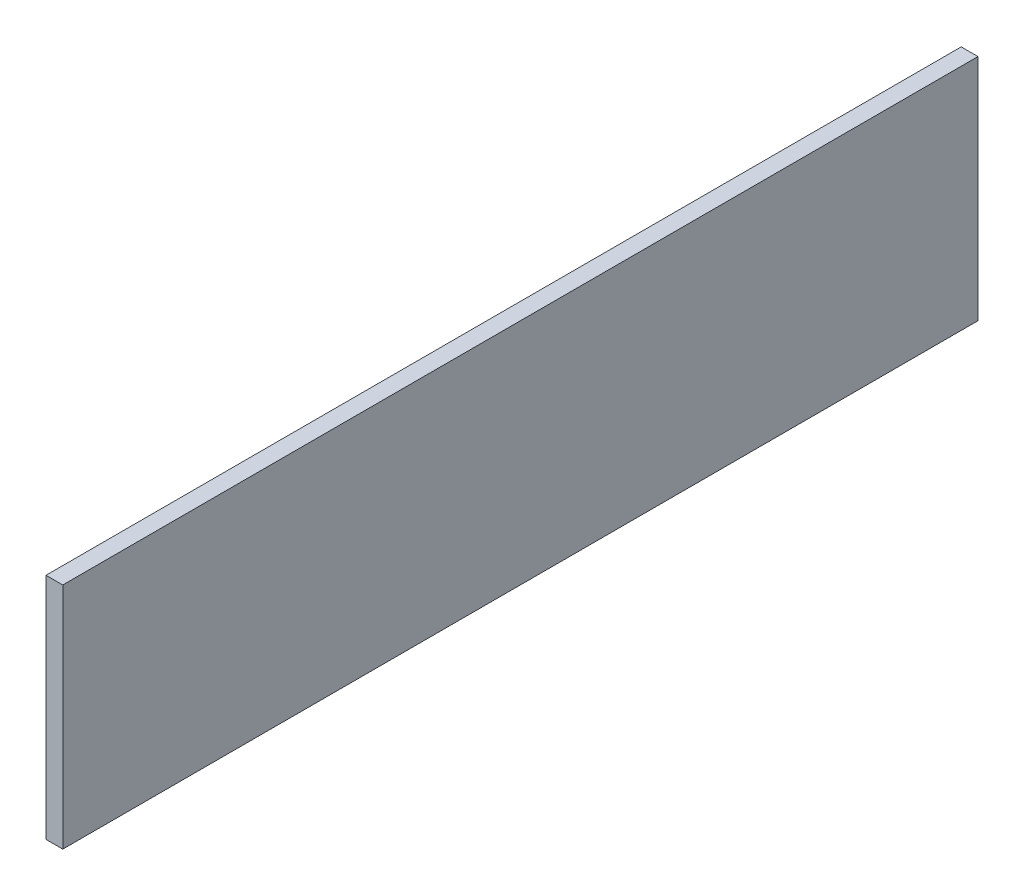
ISO-10303-21;
HEADER;
FILE_DESCRIPTION(('STEP AP214'),'2;1');
FILE_NAME('part.step','',(''),(''),'','','');
FILE_SCHEMA(('AUTOMOTIVE_DESIGN { 1 0 10303 214 1 1 1 1 }'));
ENDSEC;
DATA;
#1=APPLICATION_CONTEXT('core data for automotive mechanical design processes');
#2=APPLICATION_PROTOCOL_DEFINITION('international standard','automotive_design',2000,#1);
#3=PRODUCT_CONTEXT('',#1,'mechanical');
#4=PRODUCT('Part','Part','',(#3));
#5=PRODUCT_RELATED_PRODUCT_CATEGORY('part','',(#4));
#6=PRODUCT_DEFINITION_FORMATION('','',#4);
#7=PRODUCT_DEFINITION_CONTEXT('part definition',#1,'design');
#8=PRODUCT_DEFINITION('design','',#6,#7);
#9=PRODUCT_DEFINITION_SHAPE('','',#8);
#10=(LENGTH_UNIT() NAMED_UNIT(*) SI_UNIT(.MILLI.,.METRE.));
#11=(NAMED_UNIT(*) PLANE_ANGLE_UNIT() SI_UNIT($,.RADIAN.));
#12=(NAMED_UNIT(*) SI_UNIT($,.STERADIAN.) SOLID_ANGLE_UNIT());
#13=UNCERTAINTY_MEASURE_WITH_UNIT(LENGTH_MEASURE(1.E-05),#10,'distance_accuracy_value','');
#14=(GEOMETRIC_REPRESENTATION_CONTEXT(3) GLOBAL_UNCERTAINTY_ASSIGNED_CONTEXT((#13)) GLOBAL_UNIT_ASSIGNED_CONTEXT((#10,
#11,#12)) REPRESENTATION_CONTEXT('',''));
#15=CARTESIAN_POINT('',(0.,0.,0.));
#16=DIRECTION('',(0.,0.,1.));
#17=DIRECTION('',(1.,0.,0.));
#18=AXIS2_PLACEMENT_3D('',#15,#16,#17);
#19=CARTESIAN_POINT('',(5.588,-38.1,-152.4));
#20=DIRECTION('',(0.,0.,1.));
#21=DIRECTION('',(1.,0.,0.));
#22=AXIS2_PLACEMENT_3D('',#19,#20,#21);
#23=PLANE('',#22);
#24=DIRECTION('',(0.,1.,0.));
#25=VECTOR('',#24,1.);
#26=CARTESIAN_POINT('',(0.,-38.1,-152.4));
#27=LINE('',#26,#25);
#28=CARTESIAN_POINT('',(0.,-38.1,-152.4));
#29=VERTEX_POINT('',#28);
#30=CARTESIAN_POINT('',(0.,38.1,-152.4));
#31=VERTEX_POINT('',#30);
#32=EDGE_CURVE('E96',#29,#31,#27,.T.);
#33=ORIENTED_EDGE('',*,*,#32,.T.);
#34=DIRECTION('',(-1.,0.,0.));
#35=VECTOR('',#34,1.);
#36=CARTESIAN_POINT('',(5.588,38.1,-152.4));
#37=LINE('',#36,#35);
#38=CARTESIAN_POINT('',(5.588,38.1,-152.4));
#39=VERTEX_POINT('',#38);
#40=EDGE_CURVE('E11',#39,#31,#37,.T.);
#41=ORIENTED_EDGE('',*,*,#40,.F.);
#42=DIRECTION('',(0.,1.,0.));
#43=VECTOR('',#42,1.);
#44=CARTESIAN_POINT('',(5.588,-38.1,-152.4));
#45=LINE('',#44,#43);
#46=CARTESIAN_POINT('',(5.588,-38.1,-152.4));
#47=VERTEX_POINT('',#46);
#48=EDGE_CURVE('E84',#47,#39,#45,.T.);
#49=ORIENTED_EDGE('',*,*,#48,.F.);
#50=DIRECTION('',(-1.,0.,0.));
#51=VECTOR('',#50,1.);
#52=CARTESIAN_POINT('',(5.588,-38.1,-152.4));
#53=LINE('',#52,#51);
#54=EDGE_CURVE('E92',#47,#29,#53,.T.);
#55=ORIENTED_EDGE('',*,*,#54,.T.);
#56=EDGE_LOOP('',(#33,#41,#49,#55));
#57=FACE_BOUND('',#56,.T.);
#58=ADVANCED_FACE('F33',(#57),#23,.F.);
#59=CARTESIAN_POINT('',(5.588,38.1,152.4));
#60=DIRECTION('',(0.,-1.,0.));
#61=DIRECTION('',(0.,0.,-1.));
#62=AXIS2_PLACEMENT_3D('',#59,#60,#61);
#63=PLANE('',#62);
#64=DIRECTION('',(0.,0.,1.));
#65=VECTOR('',#64,1.);
#66=CARTESIAN_POINT('',(0.,38.1,152.4));
#67=LINE('',#66,#65);
#68=CARTESIAN_POINT('',(0.,38.1,152.4));
#69=VERTEX_POINT('',#68);
#70=EDGE_CURVE('E88',#31,#69,#67,.T.);
#71=ORIENTED_EDGE('',*,*,#70,.T.);
#72=DIRECTION('',(-1.,0.,0.));
#73=VECTOR('',#72,1.);
#74=CARTESIAN_POINT('',(5.588,38.1,152.4));
#75=LINE('',#74,#73);
#76=CARTESIAN_POINT('',(5.588,38.1,152.4));
#77=VERTEX_POINT('',#76);
#78=EDGE_CURVE('E41',#77,#69,#75,.T.);
#79=ORIENTED_EDGE('',*,*,#78,.F.);
#80=DIRECTION('',(0.,0.,1.));
#81=VECTOR('',#80,1.);
#82=CARTESIAN_POINT('',(5.588,38.1,152.4));
#83=LINE('',#82,#81);
#84=EDGE_CURVE('E79',#39,#77,#83,.T.);
#85=ORIENTED_EDGE('',*,*,#84,.F.);
#86=ORIENTED_EDGE('',*,*,#40,.T.);
#87=EDGE_LOOP('',(#71,#79,#85,#86));
#88=FACE_BOUND('',#87,.T.);
#89=ADVANCED_FACE('F87',(#88),#63,.F.);
#90=CARTESIAN_POINT('',(5.588,-38.1,152.4));
#91=DIRECTION('',(0.,0.,-1.));
#92=DIRECTION('',(-1.,0.,0.));
#93=AXIS2_PLACEMENT_3D('',#90,#91,#92);
#94=PLANE('',#93);
#95=DIRECTION('',(0.,-1.,0.));
#96=VECTOR('',#95,1.);
#97=CARTESIAN_POINT('',(0.,-38.1,152.4));
#98=LINE('',#97,#96);
#99=CARTESIAN_POINT('',(0.,-38.1,152.4));
#100=VERTEX_POINT('',#99);
#101=EDGE_CURVE('E66',#69,#100,#98,.T.);
#102=ORIENTED_EDGE('',*,*,#101,.T.);
#103=DIRECTION('',(-1.,0.,0.));
#104=VECTOR('',#103,1.);
#105=CARTESIAN_POINT('',(5.588,-38.1,152.4));
#106=LINE('',#105,#104);
#107=CARTESIAN_POINT('',(5.588,-38.1,152.4));
#108=VERTEX_POINT('',#107);
#109=EDGE_CURVE('E89',#108,#100,#106,.T.);
#110=ORIENTED_EDGE('',*,*,#109,.F.);
#111=DIRECTION('',(0.,-1.,0.));
#112=VECTOR('',#111,1.);
#113=CARTESIAN_POINT('',(5.588,-38.1,152.4));
#114=LINE('',#113,#112);
#115=EDGE_CURVE('E82',#77,#108,#114,.T.);
#116=ORIENTED_EDGE('',*,*,#115,.F.);
#117=ORIENTED_EDGE('',*,*,#78,.T.);
#118=EDGE_LOOP('',(#102,#110,#116,#117));
#119=FACE_BOUND('',#118,.T.);
#120=ADVANCED_FACE('F90',(#119),#94,.F.);
#121=CARTESIAN_POINT('',(5.588,-38.1,152.4));
#122=DIRECTION('',(0.,1.,0.));
#123=DIRECTION('',(0.,0.,1.));
#124=AXIS2_PLACEMENT_3D('',#121,#122,#123);
#125=PLANE('',#124);
#126=DIRECTION('',(0.,0.,-1.));
#127=VECTOR('',#126,1.);
#128=CARTESIAN_POINT('',(0.,-38.1,152.4));
#129=LINE('',#128,#127);
#130=EDGE_CURVE('E72',#100,#29,#129,.T.);
#131=ORIENTED_EDGE('',*,*,#130,.T.);
#132=ORIENTED_EDGE('',*,*,#54,.F.);
#133=DIRECTION('',(0.,0.,-1.));
#134=VECTOR('',#133,1.);
#135=CARTESIAN_POINT('',(5.588,-38.1,152.4));
#136=LINE('',#135,#134);
#137=EDGE_CURVE('E49',#108,#47,#136,.T.);
#138=ORIENTED_EDGE('',*,*,#137,.F.);
#139=ORIENTED_EDGE('',*,*,#109,.T.);
#140=EDGE_LOOP('',(#131,#132,#138,#139));
#141=FACE_BOUND('',#140,.T.);
#142=ADVANCED_FACE('F103',(#141),#125,.F.);
#143=CARTESIAN_POINT('',(5.588,0.,0.));
#144=DIRECTION('',(-1.,0.,0.));
#145=DIRECTION('',(0.,0.,1.));
#146=AXIS2_PLACEMENT_3D('',#143,#144,#145);
#147=PLANE('',#146);
#148=ORIENTED_EDGE('',*,*,#48,.T.);
#149=ORIENTED_EDGE('',*,*,#84,.T.);
#150=ORIENTED_EDGE('',*,*,#115,.T.);
#151=ORIENTED_EDGE('',*,*,#137,.T.);
#152=EDGE_LOOP('',(#148,#149,#150,#151));
#153=FACE_BOUND('',#152,.T.);
#154=ADVANCED_FACE('F80',(#153),#147,.F.);
#155=CARTESIAN_POINT('',(0.,0.,0.));
#156=DIRECTION('',(-1.,0.,0.));
#157=DIRECTION('',(0.,0.,1.));
#158=AXIS2_PLACEMENT_3D('',#155,#156,#157);
#159=PLANE('',#158);
#160=ORIENTED_EDGE('',*,*,#32,.F.);
#161=ORIENTED_EDGE('',*,*,#130,.F.);
#162=ORIENTED_EDGE('',*,*,#101,.F.);
#163=ORIENTED_EDGE('',*,*,#70,.F.);
#164=EDGE_LOOP('',(#160,#161,#162,#163));
#165=FACE_BOUND('',#164,.T.);
#166=ADVANCED_FACE('F106',(#165),#159,.T.);
#167=CLOSED_SHELL('',(#58,#89,#120,#142,#154,#166));
#168=MANIFOLD_SOLID_BREP('B2',#167);
#169=ADVANCED_BREP_SHAPE_REPRESENTATION('',(#18,#168),#14);
#170=SHAPE_DEFINITION_REPRESENTATION(#9,#169);
ENDSEC;
END-ISO-10303-21;
